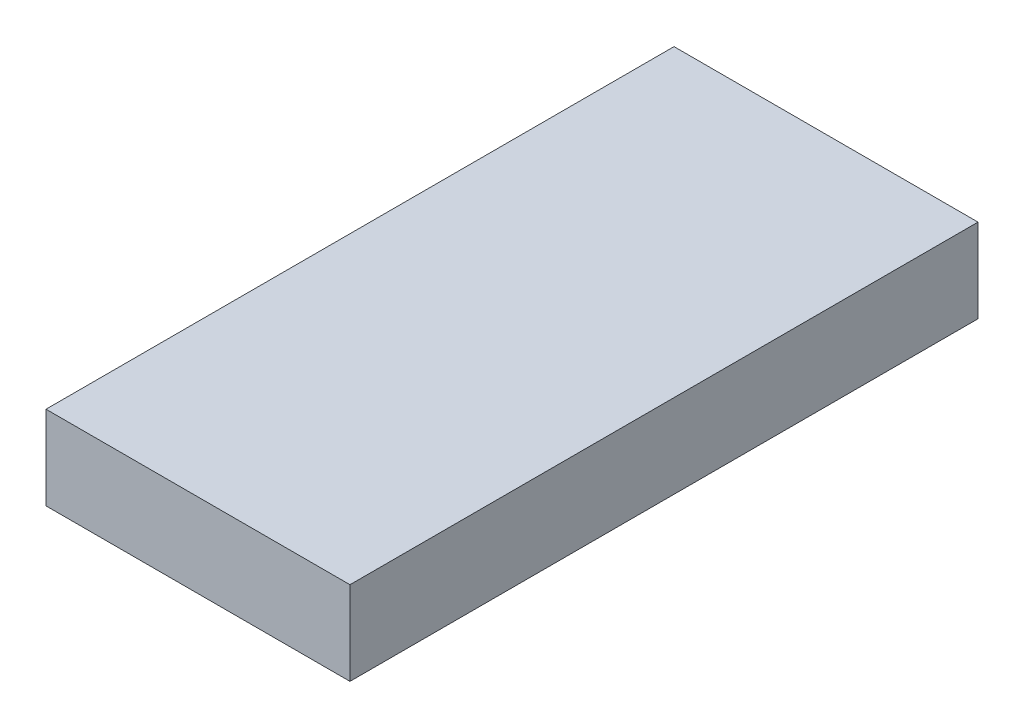
ISO-10303-21;
HEADER;
FILE_DESCRIPTION(('STEP AP214'),'2;1');
FILE_NAME('part.step','',(''),(''),'','','');
FILE_SCHEMA(('AUTOMOTIVE_DESIGN { 1 0 10303 214 1 1 1 1 }'));
ENDSEC;
DATA;
#1=APPLICATION_CONTEXT('core data for automotive mechanical design processes');
#2=APPLICATION_PROTOCOL_DEFINITION('international standard','automotive_design',2000,#1);
#3=PRODUCT_CONTEXT('',#1,'mechanical');
#4=PRODUCT('Part','Part','',(#3));
#5=PRODUCT_RELATED_PRODUCT_CATEGORY('part','',(#4));
#6=PRODUCT_DEFINITION_FORMATION('','',#4);
#7=PRODUCT_DEFINITION_CONTEXT('part definition',#1,'design');
#8=PRODUCT_DEFINITION('design','',#6,#7);
#9=PRODUCT_DEFINITION_SHAPE('','',#8);
#10=(LENGTH_UNIT() NAMED_UNIT(*) SI_UNIT(.MILLI.,.METRE.));
#11=(NAMED_UNIT(*) PLANE_ANGLE_UNIT() SI_UNIT($,.RADIAN.));
#12=(NAMED_UNIT(*) SI_UNIT($,.STERADIAN.) SOLID_ANGLE_UNIT());
#13=UNCERTAINTY_MEASURE_WITH_UNIT(LENGTH_MEASURE(1.E-05),#10,'distance_accuracy_value','');
#14=(GEOMETRIC_REPRESENTATION_CONTEXT(3) GLOBAL_UNCERTAINTY_ASSIGNED_CONTEXT((#13)) GLOBAL_UNIT_ASSIGNED_CONTEXT((#10,
#11,#12)) REPRESENTATION_CONTEXT('',''));
#15=CARTESIAN_POINT('',(0.,0.,0.));
#16=DIRECTION('',(0.,0.,1.));
#17=DIRECTION('',(1.,0.,0.));
#18=AXIS2_PLACEMENT_3D('',#15,#16,#17);
#19=CARTESIAN_POINT('',(-31.9286518367635,20.,-126.053511122427));
#20=DIRECTION('',(1.,0.,0.));
#21=DIRECTION('',(0.,0.,-1.));
#22=AXIS2_PLACEMENT_3D('',#19,#20,#21);
#23=PLANE('',#22);
#24=DIRECTION('',(0.,0.,1.));
#25=VECTOR('',#24,1.);
#26=CARTESIAN_POINT('',(-31.9286518367635,0.,-126.053511122427));
#27=LINE('',#26,#25);
#28=CARTESIAN_POINT('',(-31.9286518367635,0.,-126.053511122427));
#29=VERTEX_POINT('',#28);
#30=CARTESIAN_POINT('',(-31.9286518367635,0.,23.9464888775726));
#31=VERTEX_POINT('',#30);
#32=EDGE_CURVE('E96',#29,#31,#27,.T.);
#33=ORIENTED_EDGE('',*,*,#32,.T.);
#34=DIRECTION('',(0.,-1.,0.));
#35=VECTOR('',#34,1.);
#36=CARTESIAN_POINT('',(-31.9286518367635,20.,23.9464888775726));
#37=LINE('',#36,#35);
#38=CARTESIAN_POINT('',(-31.9286518367635,20.,23.9464888775726));
#39=VERTEX_POINT('',#38);
#40=EDGE_CURVE('E11',#39,#31,#37,.T.);
#41=ORIENTED_EDGE('',*,*,#40,.F.);
#42=DIRECTION('',(0.,0.,1.));
#43=VECTOR('',#42,1.);
#44=CARTESIAN_POINT('',(-31.9286518367635,20.,-126.053511122427));
#45=LINE('',#44,#43);
#46=CARTESIAN_POINT('',(-31.9286518367635,20.,-126.053511122427));
#47=VERTEX_POINT('',#46);
#48=EDGE_CURVE('E84',#47,#39,#45,.T.);
#49=ORIENTED_EDGE('',*,*,#48,.F.);
#50=DIRECTION('',(0.,-1.,0.));
#51=VECTOR('',#50,1.);
#52=CARTESIAN_POINT('',(-31.9286518367635,20.,-126.053511122427));
#53=LINE('',#52,#51);
#54=EDGE_CURVE('E92',#47,#29,#53,.T.);
#55=ORIENTED_EDGE('',*,*,#54,.T.);
#56=EDGE_LOOP('',(#33,#41,#49,#55));
#57=FACE_BOUND('',#56,.T.);
#58=ADVANCED_FACE('F33',(#57),#23,.F.);
#59=CARTESIAN_POINT('',(-31.9286518367635,20.,23.9464888775726));
#60=DIRECTION('',(0.,0.,-1.));
#61=DIRECTION('',(-1.,0.,0.));
#62=AXIS2_PLACEMENT_3D('',#59,#60,#61);
#63=PLANE('',#62);
#64=DIRECTION('',(1.,0.,0.));
#65=VECTOR('',#64,1.);
#66=CARTESIAN_POINT('',(-31.9286518367635,0.,23.9464888775726));
#67=LINE('',#66,#65);
#68=CARTESIAN_POINT('',(40.6713481632365,0.,23.9464888775726));
#69=VERTEX_POINT('',#68);
#70=EDGE_CURVE('E88',#31,#69,#67,.T.);
#71=ORIENTED_EDGE('',*,*,#70,.T.);
#72=DIRECTION('',(0.,-1.,0.));
#73=VECTOR('',#72,1.);
#74=CARTESIAN_POINT('',(40.6713481632365,20.,23.9464888775726));
#75=LINE('',#74,#73);
#76=CARTESIAN_POINT('',(40.6713481632365,20.,23.9464888775726));
#77=VERTEX_POINT('',#76);
#78=EDGE_CURVE('E41',#77,#69,#75,.T.);
#79=ORIENTED_EDGE('',*,*,#78,.F.);
#80=DIRECTION('',(1.,0.,0.));
#81=VECTOR('',#80,1.);
#82=CARTESIAN_POINT('',(-31.9286518367635,20.,23.9464888775726));
#83=LINE('',#82,#81);
#84=EDGE_CURVE('E79',#39,#77,#83,.T.);
#85=ORIENTED_EDGE('',*,*,#84,.F.);
#86=ORIENTED_EDGE('',*,*,#40,.T.);
#87=EDGE_LOOP('',(#71,#79,#85,#86));
#88=FACE_BOUND('',#87,.T.);
#89=ADVANCED_FACE('F87',(#88),#63,.F.);
#90=CARTESIAN_POINT('',(40.6713481632365,20.,-126.053511122427));
#91=DIRECTION('',(-1.,0.,0.));
#92=DIRECTION('',(0.,0.,1.));
#93=AXIS2_PLACEMENT_3D('',#90,#91,#92);
#94=PLANE('',#93);
#95=DIRECTION('',(0.,0.,-1.));
#96=VECTOR('',#95,1.);
#97=CARTESIAN_POINT('',(40.6713481632365,0.,-126.053511122427));
#98=LINE('',#97,#96);
#99=CARTESIAN_POINT('',(40.6713481632365,0.,-126.053511122427));
#100=VERTEX_POINT('',#99);
#101=EDGE_CURVE('E66',#69,#100,#98,.T.);
#102=ORIENTED_EDGE('',*,*,#101,.T.);
#103=DIRECTION('',(0.,-1.,0.));
#104=VECTOR('',#103,1.);
#105=CARTESIAN_POINT('',(40.6713481632365,20.,-126.053511122427));
#106=LINE('',#105,#104);
#107=CARTESIAN_POINT('',(40.6713481632365,20.,-126.053511122427));
#108=VERTEX_POINT('',#107);
#109=EDGE_CURVE('E89',#108,#100,#106,.T.);
#110=ORIENTED_EDGE('',*,*,#109,.F.);
#111=DIRECTION('',(0.,0.,-1.));
#112=VECTOR('',#111,1.);
#113=CARTESIAN_POINT('',(40.6713481632365,20.,-126.053511122427));
#114=LINE('',#113,#112);
#115=EDGE_CURVE('E82',#77,#108,#114,.T.);
#116=ORIENTED_EDGE('',*,*,#115,.F.);
#117=ORIENTED_EDGE('',*,*,#78,.T.);
#118=EDGE_LOOP('',(#102,#110,#116,#117));
#119=FACE_BOUND('',#118,.T.);
#120=ADVANCED_FACE('F90',(#119),#94,.F.);
#121=CARTESIAN_POINT('',(-31.9286518367635,20.,-126.053511122427));
#122=DIRECTION('',(0.,0.,1.));
#123=DIRECTION('',(1.,0.,0.));
#124=AXIS2_PLACEMENT_3D('',#121,#122,#123);
#125=PLANE('',#124);
#126=DIRECTION('',(-1.,0.,0.));
#127=VECTOR('',#126,1.);
#128=CARTESIAN_POINT('',(-31.9286518367635,0.,-126.053511122427));
#129=LINE('',#128,#127);
#130=EDGE_CURVE('E72',#100,#29,#129,.T.);
#131=ORIENTED_EDGE('',*,*,#130,.T.);
#132=ORIENTED_EDGE('',*,*,#54,.F.);
#133=DIRECTION('',(-1.,0.,0.));
#134=VECTOR('',#133,1.);
#135=CARTESIAN_POINT('',(-31.9286518367635,20.,-126.053511122427));
#136=LINE('',#135,#134);
#137=EDGE_CURVE('E49',#108,#47,#136,.T.);
#138=ORIENTED_EDGE('',*,*,#137,.F.);
#139=ORIENTED_EDGE('',*,*,#109,.T.);
#140=EDGE_LOOP('',(#131,#132,#138,#139));
#141=FACE_BOUND('',#140,.T.);
#142=ADVANCED_FACE('F103',(#141),#125,.F.);
#143=CARTESIAN_POINT('',(0.,20.,0.));
#144=DIRECTION('',(0.,1.,0.));
#145=DIRECTION('',(0.,0.,1.));
#146=AXIS2_PLACEMENT_3D('',#143,#144,#145);
#147=PLANE('',#146);
#148=ORIENTED_EDGE('',*,*,#48,.T.);
#149=ORIENTED_EDGE('',*,*,#84,.T.);
#150=ORIENTED_EDGE('',*,*,#115,.T.);
#151=ORIENTED_EDGE('',*,*,#137,.T.);
#152=EDGE_LOOP('',(#148,#149,#150,#151));
#153=FACE_BOUND('',#152,.T.);
#154=ADVANCED_FACE('F80',(#153),#147,.T.);
#155=CARTESIAN_POINT('',(0.,0.,0.));
#156=DIRECTION('',(0.,1.,0.));
#157=DIRECTION('',(0.,0.,1.));
#158=AXIS2_PLACEMENT_3D('',#155,#156,#157);
#159=PLANE('',#158);
#160=ORIENTED_EDGE('',*,*,#32,.F.);
#161=ORIENTED_EDGE('',*,*,#130,.F.);
#162=ORIENTED_EDGE('',*,*,#101,.F.);
#163=ORIENTED_EDGE('',*,*,#70,.F.);
#164=EDGE_LOOP('',(#160,#161,#162,#163));
#165=FACE_BOUND('',#164,.T.);
#166=ADVANCED_FACE('F106',(#165),#159,.F.);
#167=CLOSED_SHELL('',(#58,#89,#120,#142,#154,#166));
#168=MANIFOLD_SOLID_BREP('B2',#167);
#169=ADVANCED_BREP_SHAPE_REPRESENTATION('',(#18,#168),#14);
#170=SHAPE_DEFINITION_REPRESENTATION(#9,#169);
ENDSEC;
END-ISO-10303-21;
